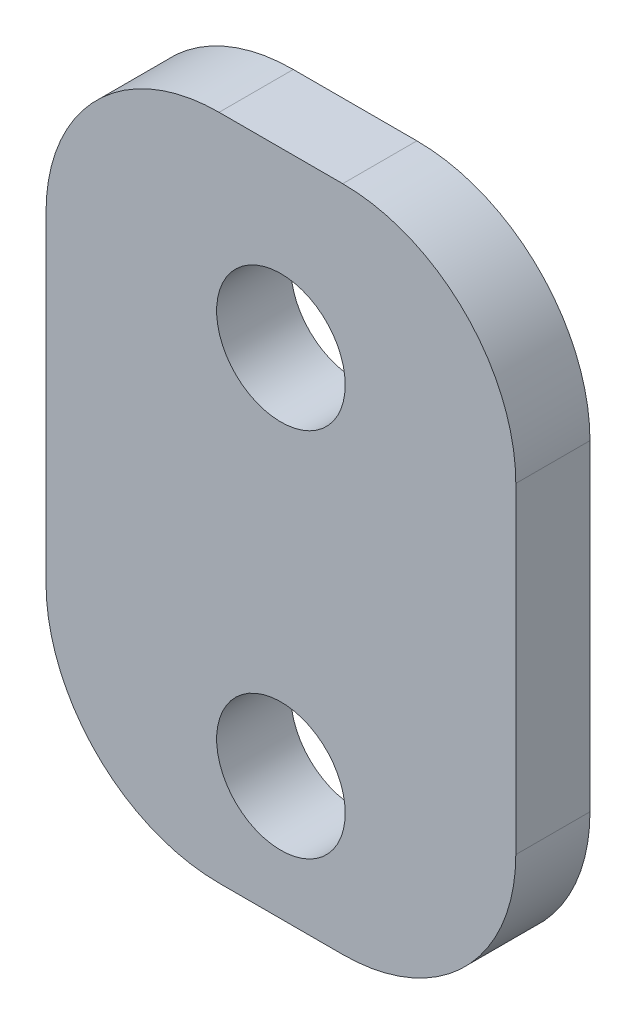
ISO-10303-21;
HEADER;
FILE_DESCRIPTION(('STEP AP214'),'2;1');
FILE_NAME('part.step','',(''),(''),'','','');
FILE_SCHEMA(('AUTOMOTIVE_DESIGN { 1 0 10303 214 1 1 1 1 }'));
ENDSEC;
DATA;
#1=APPLICATION_CONTEXT('core data for automotive mechanical design processes');
#2=APPLICATION_PROTOCOL_DEFINITION('international standard','automotive_design',2000,#1);
#3=PRODUCT_CONTEXT('',#1,'mechanical');
#4=PRODUCT('Part','Part','',(#3));
#5=PRODUCT_RELATED_PRODUCT_CATEGORY('part','',(#4));
#6=PRODUCT_DEFINITION_FORMATION('','',#4);
#7=PRODUCT_DEFINITION_CONTEXT('part definition',#1,'design');
#8=PRODUCT_DEFINITION('design','',#6,#7);
#9=PRODUCT_DEFINITION_SHAPE('','',#8);
#10=(LENGTH_UNIT() NAMED_UNIT(*) SI_UNIT(.MILLI.,.METRE.));
#11=(NAMED_UNIT(*) PLANE_ANGLE_UNIT() SI_UNIT($,.RADIAN.));
#12=(NAMED_UNIT(*) SI_UNIT($,.STERADIAN.) SOLID_ANGLE_UNIT());
#13=UNCERTAINTY_MEASURE_WITH_UNIT(LENGTH_MEASURE(1.E-05),#10,'distance_accuracy_value','');
#14=(GEOMETRIC_REPRESENTATION_CONTEXT(3) GLOBAL_UNCERTAINTY_ASSIGNED_CONTEXT((#13)) GLOBAL_UNIT_ASSIGNED_CONTEXT((#10,
#11,#12)) REPRESENTATION_CONTEXT('',''));
#15=CARTESIAN_POINT('',(0.,0.,0.));
#16=DIRECTION('',(0.,0.,1.));
#17=DIRECTION('',(1.,0.,0.));
#18=AXIS2_PLACEMENT_3D('',#15,#16,#17);
#19=CARTESIAN_POINT('',(9.49999999999124,-13.0000000000016,-3.));
#20=DIRECTION('',(0.,1.,0.));
#21=DIRECTION('',(0.,0.,1.));
#22=AXIS2_PLACEMENT_3D('',#19,#20,#21);
#23=PLANE('',#22);
#24=DIRECTION('',(-1.,0.,0.));
#25=VECTOR('',#24,1.);
#26=CARTESIAN_POINT('',(9.49999999999124,-13.0000000000016,-3.));
#27=LINE('',#26,#25);
#28=CARTESIAN_POINT('',(2.49999999999124,-13.0000000000016,-3.));
#29=VERTEX_POINT('',#28);
#30=CARTESIAN_POINT('',(-2.50000000000871,-13.0000000000016,-3.));
#31=VERTEX_POINT('',#30);
#32=EDGE_CURVE('E110',#29,#31,#27,.T.);
#33=ORIENTED_EDGE('',*,*,#32,.T.);
#34=DIRECTION('',(0.,0.,1.));
#35=VECTOR('',#34,1.);
#36=CARTESIAN_POINT('',(-2.50000000000871,-13.0000000000016,-3.));
#37=LINE('',#36,#35);
#38=CARTESIAN_POINT('',(-2.50000000000871,-13.0000000000016,0.));
#39=VERTEX_POINT('',#38);
#40=EDGE_CURVE('E156',#31,#39,#37,.T.);
#41=ORIENTED_EDGE('',*,*,#40,.T.);
#42=DIRECTION('',(-1.,0.,0.));
#43=VECTOR('',#42,1.);
#44=CARTESIAN_POINT('',(9.49999999999124,-13.0000000000016,0.));
#45=LINE('',#44,#43);
#46=CARTESIAN_POINT('',(2.49999999999124,-13.0000000000016,0.));
#47=VERTEX_POINT('',#46);
#48=EDGE_CURVE('E133',#47,#39,#45,.T.);
#49=ORIENTED_EDGE('',*,*,#48,.F.);
#50=DIRECTION('',(0.,0.,1.));
#51=VECTOR('',#50,1.);
#52=CARTESIAN_POINT('',(2.49999999999124,-13.0000000000016,-3.));
#53=LINE('',#52,#51);
#54=EDGE_CURVE('E151',#47,#29,#53,.F.);
#55=ORIENTED_EDGE('',*,*,#54,.T.);
#56=EDGE_LOOP('',(#33,#41,#49,#55));
#57=FACE_BOUND('',#56,.T.);
#58=ADVANCED_FACE('F36',(#57),#23,.T.);
#59=CARTESIAN_POINT('',(9.49999999999124,-33.0000000000016,-3.));
#60=DIRECTION('',(1.,0.,0.));
#61=DIRECTION('',(0.,0.,-1.));
#62=AXIS2_PLACEMENT_3D('',#59,#60,#61);
#63=PLANE('',#62);
#64=DIRECTION('',(0.,1.,0.));
#65=VECTOR('',#64,1.);
#66=CARTESIAN_POINT('',(9.49999999999124,-33.0000000000016,-3.));
#67=LINE('',#66,#65);
#68=CARTESIAN_POINT('',(9.49999999999124,-33.0000000000016,-3.));
#69=VERTEX_POINT('',#68);
#70=CARTESIAN_POINT('',(9.49999999999124,-20.0000000000016,-3.));
#71=VERTEX_POINT('',#70);
#72=EDGE_CURVE('E118',#69,#71,#67,.T.);
#73=ORIENTED_EDGE('',*,*,#72,.T.);
#74=DIRECTION('',(0.,0.,1.));
#75=VECTOR('',#74,1.);
#76=CARTESIAN_POINT('',(9.49999999999124,-20.0000000000016,-3.));
#77=LINE('',#76,#75);
#78=CARTESIAN_POINT('',(9.49999999999124,-20.0000000000016,0.));
#79=VERTEX_POINT('',#78);
#80=EDGE_CURVE('E11',#71,#79,#77,.T.);
#81=ORIENTED_EDGE('',*,*,#80,.T.);
#82=DIRECTION('',(0.,1.,0.));
#83=VECTOR('',#82,1.);
#84=CARTESIAN_POINT('',(9.49999999999124,-33.0000000000016,0.));
#85=LINE('',#84,#83);
#86=CARTESIAN_POINT('',(9.49999999999124,-33.0000000000016,0.));
#87=VERTEX_POINT('',#86);
#88=EDGE_CURVE('E146',#87,#79,#85,.T.);
#89=ORIENTED_EDGE('',*,*,#88,.F.);
#90=DIRECTION('',(0.,0.,1.));
#91=VECTOR('',#90,1.);
#92=CARTESIAN_POINT('',(9.49999999999124,-33.0000000000016,-3.));
#93=LINE('',#92,#91);
#94=EDGE_CURVE('E149',#69,#87,#93,.T.);
#95=ORIENTED_EDGE('',*,*,#94,.F.);
#96=EDGE_LOOP('',(#73,#81,#89,#95));
#97=FACE_BOUND('',#96,.T.);
#98=ADVANCED_FACE('F177',(#97),#63,.T.);
#99=CARTESIAN_POINT('',(2.49999999999124,-33.0000000000016,-3.));
#100=DIRECTION('',(0.,0.,1.));
#101=DIRECTION('',(1.,0.,0.));
#102=AXIS2_PLACEMENT_3D('',#99,#100,#101);
#103=CYLINDRICAL_SURFACE('',#102,7.);
#104=CARTESIAN_POINT('',(2.49999999999124,-33.0000000000016,0.));
#105=DIRECTION('',(0.,0.,1.));
#106=DIRECTION('',(1.,0.,0.));
#107=AXIS2_PLACEMENT_3D('',#104,#105,#106);
#108=CIRCLE('',#107,7.);
#109=CARTESIAN_POINT('',(2.49999999999122,-40.0000000000016,0.));
#110=VERTEX_POINT('',#109);
#111=EDGE_CURVE('E143',#110,#87,#108,.T.);
#112=ORIENTED_EDGE('',*,*,#111,.F.);
#113=DIRECTION('',(0.,0.,1.));
#114=VECTOR('',#113,1.);
#115=CARTESIAN_POINT('',(2.49999999999122,-40.0000000000016,-3.));
#116=LINE('',#115,#114);
#117=CARTESIAN_POINT('',(2.49999999999122,-40.0000000000016,-3.));
#118=VERTEX_POINT('',#117);
#119=EDGE_CURVE('E152',#118,#110,#116,.T.);
#120=ORIENTED_EDGE('',*,*,#119,.F.);
#121=CARTESIAN_POINT('',(2.49999999999124,-33.0000000000016,-3.));
#122=DIRECTION('',(0.,0.,1.));
#123=DIRECTION('',(1.,0.,0.));
#124=AXIS2_PLACEMENT_3D('',#121,#122,#123);
#125=CIRCLE('',#124,7.);
#126=EDGE_CURVE('E126',#118,#69,#125,.T.);
#127=ORIENTED_EDGE('',*,*,#126,.T.);
#128=ORIENTED_EDGE('',*,*,#94,.T.);
#129=EDGE_LOOP('',(#112,#120,#127,#128));
#130=FACE_BOUND('',#129,.T.);
#131=ADVANCED_FACE('F181',(#130),#103,.T.);
#132=CARTESIAN_POINT('',(-2.50000000000878,-40.0000000000016,-3.));
#133=DIRECTION('',(0.,-1.,0.));
#134=DIRECTION('',(1.,0.,0.));
#135=AXIS2_PLACEMENT_3D('',#132,#133,#134);
#136=PLANE('',#135);
#137=DIRECTION('',(1.,0.,0.));
#138=VECTOR('',#137,1.);
#139=CARTESIAN_POINT('',(-2.50000000000878,-40.0000000000016,0.));
#140=LINE('',#139,#138);
#141=CARTESIAN_POINT('',(-2.50000000000878,-40.0000000000016,0.));
#142=VERTEX_POINT('',#141);
#143=EDGE_CURVE('E140',#142,#110,#140,.T.);
#144=ORIENTED_EDGE('',*,*,#143,.F.);
#145=DIRECTION('',(0.,0.,1.));
#146=VECTOR('',#145,1.);
#147=CARTESIAN_POINT('',(-2.50000000000878,-40.0000000000016,-3.));
#148=LINE('',#147,#146);
#149=CARTESIAN_POINT('',(-2.50000000000878,-40.0000000000016,-3.));
#150=VERTEX_POINT('',#149);
#151=EDGE_CURVE('E117',#150,#142,#148,.T.);
#152=ORIENTED_EDGE('',*,*,#151,.F.);
#153=DIRECTION('',(1.,0.,0.));
#154=VECTOR('',#153,1.);
#155=CARTESIAN_POINT('',(-2.50000000000878,-40.0000000000016,-3.));
#156=LINE('',#155,#154);
#157=EDGE_CURVE('E124',#150,#118,#156,.T.);
#158=ORIENTED_EDGE('',*,*,#157,.T.);
#159=ORIENTED_EDGE('',*,*,#119,.T.);
#160=EDGE_LOOP('',(#144,#152,#158,#159));
#161=FACE_BOUND('',#160,.T.);
#162=ADVANCED_FACE('F183',(#161),#136,.T.);
#163=CARTESIAN_POINT('',(-2.50000000000875,-33.0000000000016,-3.));
#164=DIRECTION('',(0.,0.,1.));
#165=DIRECTION('',(1.,0.,0.));
#166=AXIS2_PLACEMENT_3D('',#163,#164,#165);
#167=CYLINDRICAL_SURFACE('',#166,7.);
#168=CARTESIAN_POINT('',(-2.50000000000875,-33.0000000000016,0.));
#169=DIRECTION('',(0.,0.,1.));
#170=DIRECTION('',(1.,0.,0.));
#171=AXIS2_PLACEMENT_3D('',#168,#169,#170);
#172=CIRCLE('',#171,7.);
#173=CARTESIAN_POINT('',(-9.50000000000876,-33.0000000000016,0.));
#174=VERTEX_POINT('',#173);
#175=EDGE_CURVE('E116',#174,#142,#172,.T.);
#176=ORIENTED_EDGE('',*,*,#175,.F.);
#177=DIRECTION('',(0.,0.,1.));
#178=VECTOR('',#177,1.);
#179=CARTESIAN_POINT('',(-9.50000000000876,-33.0000000000016,-3.));
#180=LINE('',#179,#178);
#181=CARTESIAN_POINT('',(-9.50000000000876,-33.0000000000016,-3.));
#182=VERTEX_POINT('',#181);
#183=EDGE_CURVE('E105',#182,#174,#180,.T.);
#184=ORIENTED_EDGE('',*,*,#183,.F.);
#185=CARTESIAN_POINT('',(-2.50000000000875,-33.0000000000016,-3.));
#186=DIRECTION('',(0.,0.,1.));
#187=DIRECTION('',(1.,0.,0.));
#188=AXIS2_PLACEMENT_3D('',#185,#186,#187);
#189=CIRCLE('',#188,7.);
#190=EDGE_CURVE('E109',#182,#150,#189,.T.);
#191=ORIENTED_EDGE('',*,*,#190,.T.);
#192=ORIENTED_EDGE('',*,*,#151,.T.);
#193=EDGE_LOOP('',(#176,#184,#191,#192));
#194=FACE_BOUND('',#193,.T.);
#195=ADVANCED_FACE('F114',(#194),#167,.T.);
#196=CARTESIAN_POINT('',(-9.50000000000869,-13.0000000000016,-3.));
#197=DIRECTION('',(-1.,0.,0.));
#198=DIRECTION('',(0.,-1.,0.));
#199=AXIS2_PLACEMENT_3D('',#196,#197,#198);
#200=PLANE('',#199);
#201=DIRECTION('',(0.,-1.,0.));
#202=VECTOR('',#201,1.);
#203=CARTESIAN_POINT('',(-9.50000000000869,-13.0000000000016,0.));
#204=LINE('',#203,#202);
#205=CARTESIAN_POINT('',(-9.50000000000871,-20.0000000000016,0.));
#206=VERTEX_POINT('',#205);
#207=EDGE_CURVE('E136',#206,#174,#204,.T.);
#208=ORIENTED_EDGE('',*,*,#207,.F.);
#209=DIRECTION('',(0.,0.,1.));
#210=VECTOR('',#209,1.);
#211=CARTESIAN_POINT('',(-9.50000000000871,-20.0000000000016,-3.));
#212=LINE('',#211,#210);
#213=CARTESIAN_POINT('',(-9.50000000000871,-20.0000000000016,-3.));
#214=VERTEX_POINT('',#213);
#215=EDGE_CURVE('E59',#206,#214,#212,.F.);
#216=ORIENTED_EDGE('',*,*,#215,.T.);
#217=DIRECTION('',(0.,-1.,0.));
#218=VECTOR('',#217,1.);
#219=CARTESIAN_POINT('',(-9.50000000000869,-13.0000000000016,-3.));
#220=LINE('',#219,#218);
#221=EDGE_CURVE('E102',#214,#182,#220,.T.);
#222=ORIENTED_EDGE('',*,*,#221,.T.);
#223=ORIENTED_EDGE('',*,*,#183,.T.);
#224=EDGE_LOOP('',(#208,#216,#222,#223));
#225=FACE_BOUND('',#224,.T.);
#226=ADVANCED_FACE('F104',(#225),#200,.T.);
#227=CARTESIAN_POINT('',(-2.50000000000875,-33.0000000000016,-3.));
#228=DIRECTION('',(0.,0.,1.));
#229=DIRECTION('',(1.,0.,0.));
#230=AXIS2_PLACEMENT_3D('',#227,#228,#229);
#231=PLANE('',#230);
#232=CARTESIAN_POINT('',(-8.71258923066962E-12,-20.0000000000016,-3.));
#233=DIRECTION('',(0.,0.,1.));
#234=DIRECTION('',(1.,0.,0.));
#235=AXIS2_PLACEMENT_3D('',#232,#233,#234);
#236=CIRCLE('',#235,2.6);
#237=CARTESIAN_POINT('',(2.59999999999129,-20.0000000000016,-3.));
#238=VERTEX_POINT('',#237);
#239=EDGE_CURVE('E231',#238,#238,#236,.T.);
#240=ORIENTED_EDGE('',*,*,#239,.T.);
#241=EDGE_LOOP('',(#240));
#242=FACE_BOUND('',#241,.T.);
#243=CARTESIAN_POINT('',(-8.76635143460268E-12,-35.0000000000016,-3.));
#244=DIRECTION('',(0.,0.,1.));
#245=DIRECTION('',(1.,0.,0.));
#246=AXIS2_PLACEMENT_3D('',#243,#244,#245);
#247=CIRCLE('',#246,2.6);
#248=CARTESIAN_POINT('',(2.59999999999123,-35.0000000000016,-3.));
#249=VERTEX_POINT('',#248);
#250=EDGE_CURVE('E137',#249,#249,#247,.T.);
#251=ORIENTED_EDGE('',*,*,#250,.T.);
#252=EDGE_LOOP('',(#251));
#253=FACE_BOUND('',#252,.T.);
#254=ORIENTED_EDGE('',*,*,#221,.F.);
#255=CARTESIAN_POINT('',(-2.50000000000871,-20.0000000000016,-3.));
#256=DIRECTION('',(0.,0.,1.));
#257=DIRECTION('',(1.,0.,0.));
#258=AXIS2_PLACEMENT_3D('',#255,#256,#257);
#259=CIRCLE('',#258,7.);
#260=EDGE_CURVE('E44',#214,#31,#259,.F.);
#261=ORIENTED_EDGE('',*,*,#260,.T.);
#262=ORIENTED_EDGE('',*,*,#32,.F.);
#263=CARTESIAN_POINT('',(2.49999999999124,-20.0000000000016,-3.));
#264=DIRECTION('',(0.,0.,1.));
#265=DIRECTION('',(1.,0.,0.));
#266=AXIS2_PLACEMENT_3D('',#263,#264,#265);
#267=CIRCLE('',#266,7.);
#268=EDGE_CURVE('E51',#29,#71,#267,.F.);
#269=ORIENTED_EDGE('',*,*,#268,.T.);
#270=ORIENTED_EDGE('',*,*,#72,.F.);
#271=ORIENTED_EDGE('',*,*,#126,.F.);
#272=ORIENTED_EDGE('',*,*,#157,.F.);
#273=ORIENTED_EDGE('',*,*,#190,.F.);
#274=EDGE_LOOP('',(#254,#261,#262,#269,#270,#271,#272,#273));
#275=FACE_BOUND('',#274,.T.);
#276=ADVANCED_FACE('F121',(#242,#253,#275),#231,.F.);
#277=CARTESIAN_POINT('',(-2.50000000000875,-33.0000000000016,0.));
#278=DIRECTION('',(0.,0.,1.));
#279=DIRECTION('',(1.,0.,0.));
#280=AXIS2_PLACEMENT_3D('',#277,#278,#279);
#281=PLANE('',#280);
#282=CARTESIAN_POINT('',(-8.71258923066962E-12,-20.0000000000016,0.));
#283=DIRECTION('',(0.,0.,1.));
#284=DIRECTION('',(1.,0.,0.));
#285=AXIS2_PLACEMENT_3D('',#282,#283,#284);
#286=CIRCLE('',#285,2.6);
#287=CARTESIAN_POINT('',(2.59999999999129,-20.0000000000016,0.));
#288=VERTEX_POINT('',#287);
#289=EDGE_CURVE('E226',#288,#288,#286,.T.);
#290=ORIENTED_EDGE('',*,*,#289,.F.);
#291=EDGE_LOOP('',(#290));
#292=FACE_BOUND('',#291,.T.);
#293=CARTESIAN_POINT('',(-8.76635143460268E-12,-35.0000000000016,0.));
#294=DIRECTION('',(0.,0.,1.));
#295=DIRECTION('',(1.,0.,0.));
#296=AXIS2_PLACEMENT_3D('',#293,#294,#295);
#297=CIRCLE('',#296,2.6);
#298=CARTESIAN_POINT('',(2.59999999999123,-35.0000000000016,0.));
#299=VERTEX_POINT('',#298);
#300=EDGE_CURVE('E229',#299,#299,#297,.T.);
#301=ORIENTED_EDGE('',*,*,#300,.F.);
#302=EDGE_LOOP('',(#301));
#303=FACE_BOUND('',#302,.T.);
#304=ORIENTED_EDGE('',*,*,#48,.T.);
#305=CARTESIAN_POINT('',(-2.50000000000871,-20.0000000000016,0.));
#306=DIRECTION('',(0.,0.,1.));
#307=DIRECTION('',(1.,0.,0.));
#308=AXIS2_PLACEMENT_3D('',#305,#306,#307);
#309=CIRCLE('',#308,7.);
#310=EDGE_CURVE('E161',#39,#206,#309,.T.);
#311=ORIENTED_EDGE('',*,*,#310,.T.);
#312=ORIENTED_EDGE('',*,*,#207,.T.);
#313=ORIENTED_EDGE('',*,*,#175,.T.);
#314=ORIENTED_EDGE('',*,*,#143,.T.);
#315=ORIENTED_EDGE('',*,*,#111,.T.);
#316=ORIENTED_EDGE('',*,*,#88,.T.);
#317=CARTESIAN_POINT('',(2.49999999999124,-20.0000000000016,0.));
#318=DIRECTION('',(0.,0.,1.));
#319=DIRECTION('',(1.,0.,0.));
#320=AXIS2_PLACEMENT_3D('',#317,#318,#319);
#321=CIRCLE('',#320,7.);
#322=EDGE_CURVE('E159',#79,#47,#321,.T.);
#323=ORIENTED_EDGE('',*,*,#322,.T.);
#324=EDGE_LOOP('',(#304,#311,#312,#313,#314,#315,#316,#323));
#325=FACE_BOUND('',#324,.T.);
#326=ADVANCED_FACE('F172',(#292,#303,#325),#281,.T.);
#327=CARTESIAN_POINT('',(-8.76635143460268E-12,-35.0000000000016,-3.));
#328=DIRECTION('',(0.,0.,1.));
#329=DIRECTION('',(1.,0.,0.));
#330=AXIS2_PLACEMENT_3D('',#327,#328,#329);
#331=CYLINDRICAL_SURFACE('',#330,2.6);
#332=ORIENTED_EDGE('',*,*,#250,.F.);
#333=EDGE_LOOP('',(#332));
#334=FACE_BOUND('',#333,.T.);
#335=ORIENTED_EDGE('',*,*,#300,.T.);
#336=EDGE_LOOP('',(#335));
#337=FACE_BOUND('',#336,.T.);
#338=ADVANCED_FACE('F205',(#334,#337),#331,.F.);
#339=CARTESIAN_POINT('',(-8.71258923066962E-12,-20.0000000000016,-3.));
#340=DIRECTION('',(0.,0.,1.));
#341=DIRECTION('',(1.,0.,0.));
#342=AXIS2_PLACEMENT_3D('',#339,#340,#341);
#343=CYLINDRICAL_SURFACE('',#342,2.6);
#344=ORIENTED_EDGE('',*,*,#239,.F.);
#345=EDGE_LOOP('',(#344));
#346=FACE_BOUND('',#345,.T.);
#347=ORIENTED_EDGE('',*,*,#289,.T.);
#348=EDGE_LOOP('',(#347));
#349=FACE_BOUND('',#348,.T.);
#350=ADVANCED_FACE('F200',(#346,#349),#343,.F.);
#351=CARTESIAN_POINT('',(-2.50000000000871,-20.0000000000016,-3.));
#352=DIRECTION('',(0.,0.,1.));
#353=DIRECTION('',(1.,0.,0.));
#354=AXIS2_PLACEMENT_3D('',#351,#352,#353);
#355=CYLINDRICAL_SURFACE('',#354,7.);
#356=ORIENTED_EDGE('',*,*,#260,.F.);
#357=ORIENTED_EDGE('',*,*,#215,.F.);
#358=ORIENTED_EDGE('',*,*,#310,.F.);
#359=ORIENTED_EDGE('',*,*,#40,.F.);
#360=EDGE_LOOP('',(#356,#357,#358,#359));
#361=FACE_BOUND('',#360,.T.);
#362=ADVANCED_FACE('F170',(#361),#355,.T.);
#363=CARTESIAN_POINT('',(2.49999999999124,-20.0000000000016,-3.));
#364=DIRECTION('',(0.,0.,1.));
#365=DIRECTION('',(1.,0.,0.));
#366=AXIS2_PLACEMENT_3D('',#363,#364,#365);
#367=CYLINDRICAL_SURFACE('',#366,7.);
#368=ORIENTED_EDGE('',*,*,#268,.F.);
#369=ORIENTED_EDGE('',*,*,#54,.F.);
#370=ORIENTED_EDGE('',*,*,#322,.F.);
#371=ORIENTED_EDGE('',*,*,#80,.F.);
#372=EDGE_LOOP('',(#368,#369,#370,#371));
#373=FACE_BOUND('',#372,.T.);
#374=ADVANCED_FACE('F38',(#373),#367,.T.);
#375=CLOSED_SHELL('',(#58,#98,#131,#162,#195,#226,#276,#326,#338,#350,#362,#374));
#376=MANIFOLD_SOLID_BREP('B2',#375);
#377=ADVANCED_BREP_SHAPE_REPRESENTATION('',(#18,#376),#14);
#378=SHAPE_DEFINITION_REPRESENTATION(#9,#377);
ENDSEC;
END-ISO-10303-21;
